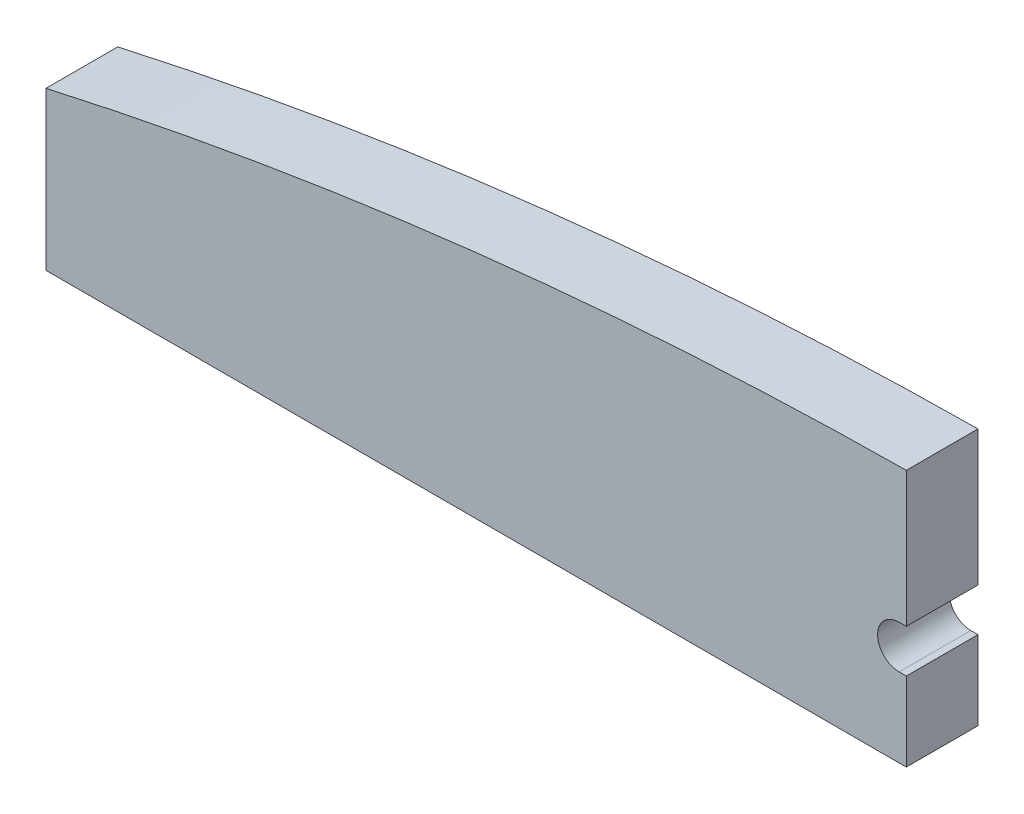
ISO-10303-21;
HEADER;
FILE_DESCRIPTION(('STEP AP214'),'2;1');
FILE_NAME('part.step','',(''),(''),'','','');
FILE_SCHEMA(('AUTOMOTIVE_DESIGN { 1 0 10303 214 1 1 1 1 }'));
ENDSEC;
DATA;
#1=APPLICATION_CONTEXT('core data for automotive mechanical design processes');
#2=APPLICATION_PROTOCOL_DEFINITION('international standard','automotive_design',2000,#1);
#3=PRODUCT_CONTEXT('',#1,'mechanical');
#4=PRODUCT('Part','Part','',(#3));
#5=PRODUCT_RELATED_PRODUCT_CATEGORY('part','',(#4));
#6=PRODUCT_DEFINITION_FORMATION('','',#4);
#7=PRODUCT_DEFINITION_CONTEXT('part definition',#1,'design');
#8=PRODUCT_DEFINITION('design','',#6,#7);
#9=PRODUCT_DEFINITION_SHAPE('','',#8);
#10=(LENGTH_UNIT() NAMED_UNIT(*) SI_UNIT(.MILLI.,.METRE.));
#11=(NAMED_UNIT(*) PLANE_ANGLE_UNIT() SI_UNIT($,.RADIAN.));
#12=(NAMED_UNIT(*) SI_UNIT($,.STERADIAN.) SOLID_ANGLE_UNIT());
#13=UNCERTAINTY_MEASURE_WITH_UNIT(LENGTH_MEASURE(1.E-05),#10,'distance_accuracy_value','');
#14=(GEOMETRIC_REPRESENTATION_CONTEXT(3) GLOBAL_UNCERTAINTY_ASSIGNED_CONTEXT((#13)) GLOBAL_UNIT_ASSIGNED_CONTEXT((#10,
#11,#12)) REPRESENTATION_CONTEXT('',''));
#15=CARTESIAN_POINT('',(0.,0.,0.));
#16=DIRECTION('',(0.,0.,1.));
#17=DIRECTION('',(1.,0.,0.));
#18=AXIS2_PLACEMENT_3D('',#15,#16,#17);
#19=CARTESIAN_POINT('',(-2.99999999999999,11.0624929759496,5.));
#20=DIRECTION('',(0.,0.,-1.));
#21=DIRECTION('',(-1.,0.,0.));
#22=AXIS2_PLACEMENT_3D('',#19,#20,#21);
#23=CYLINDRICAL_SURFACE('',#22,1.5);
#24=CARTESIAN_POINT('',(-2.99999999999999,11.0624929759496,0.));
#25=DIRECTION('',(0.,0.,1.));
#26=DIRECTION('',(1.,0.,0.));
#27=AXIS2_PLACEMENT_3D('',#24,#25,#26);
#28=CIRCLE('',#27,1.5);
#29=CARTESIAN_POINT('',(-2.99999999999999,12.5624929759496,0.));
#30=VERTEX_POINT('',#29);
#31=CARTESIAN_POINT('',(-2.99999999999999,9.56249297594958,0.));
#32=VERTEX_POINT('',#31);
#33=EDGE_CURVE('E133',#30,#32,#28,.T.);
#34=ORIENTED_EDGE('',*,*,#33,.F.);
#35=DIRECTION('',(0.,0.,-1.));
#36=VECTOR('',#35,1.);
#37=CARTESIAN_POINT('',(-2.99999999999999,12.5624929759496,5.));
#38=LINE('',#37,#36);
#39=CARTESIAN_POINT('',(-2.99999999999999,12.5624929759496,5.));
#40=VERTEX_POINT('',#39);
#41=EDGE_CURVE('E11',#40,#30,#38,.T.);
#42=ORIENTED_EDGE('',*,*,#41,.F.);
#43=CARTESIAN_POINT('',(-2.99999999999999,11.0624929759496,5.));
#44=DIRECTION('',(0.,0.,1.));
#45=DIRECTION('',(1.,0.,0.));
#46=AXIS2_PLACEMENT_3D('',#43,#44,#45);
#47=CIRCLE('',#46,1.5);
#48=CARTESIAN_POINT('',(-2.99999999999999,9.56249297594958,5.));
#49=VERTEX_POINT('',#48);
#50=EDGE_CURVE('E152',#40,#49,#47,.T.);
#51=ORIENTED_EDGE('',*,*,#50,.T.);
#52=DIRECTION('',(0.,0.,-1.));
#53=VECTOR('',#52,1.);
#54=CARTESIAN_POINT('',(-2.99999999999999,9.56249297594958,5.));
#55=LINE('',#54,#53);
#56=EDGE_CURVE('E55',#49,#32,#55,.T.);
#57=ORIENTED_EDGE('',*,*,#56,.T.);
#58=EDGE_LOOP('',(#34,#42,#51,#57));
#59=FACE_BOUND('',#58,.T.);
#60=ADVANCED_FACE('F39',(#59),#23,.F.);
#61=CARTESIAN_POINT('',(0.,12.5624929759496,5.));
#62=DIRECTION('',(0.,1.,0.));
#63=DIRECTION('',(0.,0.,1.));
#64=AXIS2_PLACEMENT_3D('',#61,#62,#63);
#65=PLANE('',#64);
#66=DIRECTION('',(1.,0.,0.));
#67=VECTOR('',#66,1.);
#68=CARTESIAN_POINT('',(0.,12.5624929759496,0.));
#69=LINE('',#68,#67);
#70=CARTESIAN_POINT('',(-2.5,12.5624929759496,0.));
#71=VERTEX_POINT('',#70);
#72=EDGE_CURVE('E135',#30,#71,#69,.T.);
#73=ORIENTED_EDGE('',*,*,#72,.T.);
#74=DIRECTION('',(0.,0.,-1.));
#75=VECTOR('',#74,1.);
#76=CARTESIAN_POINT('',(-2.5,12.5624929759496,5.));
#77=LINE('',#76,#75);
#78=CARTESIAN_POINT('',(-2.5,12.5624929759496,5.));
#79=VERTEX_POINT('',#78);
#80=EDGE_CURVE('E47',#79,#71,#77,.T.);
#81=ORIENTED_EDGE('',*,*,#80,.F.);
#82=DIRECTION('',(1.,0.,0.));
#83=VECTOR('',#82,1.);
#84=CARTESIAN_POINT('',(0.,12.5624929759496,5.));
#85=LINE('',#84,#83);
#86=EDGE_CURVE('E178',#40,#79,#85,.T.);
#87=ORIENTED_EDGE('',*,*,#86,.F.);
#88=ORIENTED_EDGE('',*,*,#41,.T.);
#89=EDGE_LOOP('',(#73,#81,#87,#88));
#90=FACE_BOUND('',#89,.T.);
#91=ADVANCED_FACE('F193',(#90),#65,.F.);
#92=CARTESIAN_POINT('',(-2.5,0.,5.));
#93=DIRECTION('',(-1.,0.,0.));
#94=DIRECTION('',(0.,0.,1.));
#95=AXIS2_PLACEMENT_3D('',#92,#93,#94);
#96=PLANE('',#95);
#97=DIRECTION('',(0.,1.,0.));
#98=VECTOR('',#97,1.);
#99=CARTESIAN_POINT('',(-2.5,0.,0.));
#100=LINE('',#99,#98);
#101=CARTESIAN_POINT('',(-2.5,21.9890348767826,0.));
#102=VERTEX_POINT('',#101);
#103=EDGE_CURVE('E137',#71,#102,#100,.T.);
#104=ORIENTED_EDGE('',*,*,#103,.T.);
#105=DIRECTION('',(0.,0.,-1.));
#106=VECTOR('',#105,1.);
#107=CARTESIAN_POINT('',(-2.5,21.9890348767826,5.));
#108=LINE('',#107,#106);
#109=CARTESIAN_POINT('',(-2.5,21.9890348767826,5.));
#110=VERTEX_POINT('',#109);
#111=EDGE_CURVE('E158',#110,#102,#108,.T.);
#112=ORIENTED_EDGE('',*,*,#111,.F.);
#113=DIRECTION('',(0.,1.,0.));
#114=VECTOR('',#113,1.);
#115=CARTESIAN_POINT('',(-2.5,0.,5.));
#116=LINE('',#115,#114);
#117=EDGE_CURVE('E166',#79,#110,#116,.T.);
#118=ORIENTED_EDGE('',*,*,#117,.F.);
#119=ORIENTED_EDGE('',*,*,#80,.T.);
#120=EDGE_LOOP('',(#104,#112,#118,#119));
#121=FACE_BOUND('',#120,.T.);
#122=ADVANCED_FACE('F164',(#121),#96,.F.);
#123=CARTESIAN_POINT('',(0.,-263.,5.));
#124=DIRECTION('',(0.,0.,-1.));
#125=DIRECTION('',(-1.,0.,0.));
#126=AXIS2_PLACEMENT_3D('',#123,#124,#125);
#127=CYLINDRICAL_SURFACE('',#126,285.);
#128=CARTESIAN_POINT('',(0.,-263.,0.));
#129=DIRECTION('',(0.,0.,1.));
#130=DIRECTION('',(1.,0.,0.));
#131=AXIS2_PLACEMENT_3D('',#128,#129,#130);
#132=CIRCLE('',#131,285.);
#133=CARTESIAN_POINT('',(-62.5,15.0624929759496,0.));
#134=VERTEX_POINT('',#133);
#135=EDGE_CURVE('E140',#134,#102,#132,.F.);
#136=ORIENTED_EDGE('',*,*,#135,.F.);
#137=DIRECTION('',(0.,0.,-1.));
#138=VECTOR('',#137,1.);
#139=CARTESIAN_POINT('',(-62.5,15.0624929759496,5.));
#140=LINE('',#139,#138);
#141=CARTESIAN_POINT('',(-62.5,15.0624929759496,5.));
#142=VERTEX_POINT('',#141);
#143=EDGE_CURVE('E156',#142,#134,#140,.T.);
#144=ORIENTED_EDGE('',*,*,#143,.F.);
#145=CARTESIAN_POINT('',(0.,-263.,5.));
#146=DIRECTION('',(0.,0.,1.));
#147=DIRECTION('',(1.,0.,0.));
#148=AXIS2_PLACEMENT_3D('',#145,#146,#147);
#149=CIRCLE('',#148,285.);
#150=EDGE_CURVE('E176',#142,#110,#149,.F.);
#151=ORIENTED_EDGE('',*,*,#150,.T.);
#152=ORIENTED_EDGE('',*,*,#111,.T.);
#153=EDGE_LOOP('',(#136,#144,#151,#152));
#154=FACE_BOUND('',#153,.T.);
#155=ADVANCED_FACE('F174',(#154),#127,.T.);
#156=CARTESIAN_POINT('',(-62.5,0.,5.));
#157=DIRECTION('',(-1.,0.,0.));
#158=DIRECTION('',(0.,0.,1.));
#159=AXIS2_PLACEMENT_3D('',#156,#157,#158);
#160=PLANE('',#159);
#161=DIRECTION('',(0.,1.,0.));
#162=VECTOR('',#161,1.);
#163=CARTESIAN_POINT('',(-62.5,0.,0.));
#164=LINE('',#163,#162);
#165=CARTESIAN_POINT('',(-62.5,4.06249297594958,0.));
#166=VERTEX_POINT('',#165);
#167=EDGE_CURVE('E143',#166,#134,#164,.T.);
#168=ORIENTED_EDGE('',*,*,#167,.F.);
#169=DIRECTION('',(0.,0.,-1.));
#170=VECTOR('',#169,1.);
#171=CARTESIAN_POINT('',(-62.5,4.06249297594958,5.));
#172=LINE('',#171,#170);
#173=CARTESIAN_POINT('',(-62.5,4.06249297594958,5.));
#174=VERTEX_POINT('',#173);
#175=EDGE_CURVE('E125',#174,#166,#172,.T.);
#176=ORIENTED_EDGE('',*,*,#175,.F.);
#177=DIRECTION('',(0.,1.,0.));
#178=VECTOR('',#177,1.);
#179=CARTESIAN_POINT('',(-62.5,0.,5.));
#180=LINE('',#179,#178);
#181=EDGE_CURVE('E115',#174,#142,#180,.T.);
#182=ORIENTED_EDGE('',*,*,#181,.T.);
#183=ORIENTED_EDGE('',*,*,#143,.T.);
#184=EDGE_LOOP('',(#168,#176,#182,#183));
#185=FACE_BOUND('',#184,.T.);
#186=ADVANCED_FACE('F204',(#185),#160,.T.);
#187=CARTESIAN_POINT('',(0.,4.06249297594958,5.));
#188=DIRECTION('',(0.,1.,0.));
#189=DIRECTION('',(0.,0.,1.));
#190=AXIS2_PLACEMENT_3D('',#187,#188,#189);
#191=PLANE('',#190);
#192=DIRECTION('',(1.,0.,0.));
#193=VECTOR('',#192,1.);
#194=CARTESIAN_POINT('',(0.,4.06249297594958,0.));
#195=LINE('',#194,#193);
#196=CARTESIAN_POINT('',(-2.5,4.06249297594958,0.));
#197=VERTEX_POINT('',#196);
#198=EDGE_CURVE('E122',#166,#197,#195,.T.);
#199=ORIENTED_EDGE('',*,*,#198,.T.);
#200=DIRECTION('',(0.,0.,-1.));
#201=VECTOR('',#200,1.);
#202=CARTESIAN_POINT('',(-2.5,4.06249297594958,5.));
#203=LINE('',#202,#201);
#204=CARTESIAN_POINT('',(-2.5,4.06249297594958,5.));
#205=VERTEX_POINT('',#204);
#206=EDGE_CURVE('E119',#205,#197,#203,.T.);
#207=ORIENTED_EDGE('',*,*,#206,.F.);
#208=DIRECTION('',(1.,0.,0.));
#209=VECTOR('',#208,1.);
#210=CARTESIAN_POINT('',(0.,4.06249297594958,5.));
#211=LINE('',#210,#209);
#212=EDGE_CURVE('E106',#174,#205,#211,.T.);
#213=ORIENTED_EDGE('',*,*,#212,.F.);
#214=ORIENTED_EDGE('',*,*,#175,.T.);
#215=EDGE_LOOP('',(#199,#207,#213,#214));
#216=FACE_BOUND('',#215,.T.);
#217=ADVANCED_FACE('F120',(#216),#191,.F.);
#218=CARTESIAN_POINT('',(-2.5,0.,5.));
#219=DIRECTION('',(-1.,0.,0.));
#220=DIRECTION('',(0.,0.,1.));
#221=AXIS2_PLACEMENT_3D('',#218,#219,#220);
#222=PLANE('',#221);
#223=DIRECTION('',(0.,1.,0.));
#224=VECTOR('',#223,1.);
#225=CARTESIAN_POINT('',(-2.5,0.,0.));
#226=LINE('',#225,#224);
#227=CARTESIAN_POINT('',(-2.5,9.56249297594958,0.));
#228=VERTEX_POINT('',#227);
#229=EDGE_CURVE('E147',#197,#228,#226,.T.);
#230=ORIENTED_EDGE('',*,*,#229,.T.);
#231=DIRECTION('',(0.,0.,-1.));
#232=VECTOR('',#231,1.);
#233=CARTESIAN_POINT('',(-2.5,9.56249297594958,5.));
#234=LINE('',#233,#232);
#235=CARTESIAN_POINT('',(-2.5,9.56249297594958,5.));
#236=VERTEX_POINT('',#235);
#237=EDGE_CURVE('E81',#236,#228,#234,.T.);
#238=ORIENTED_EDGE('',*,*,#237,.F.);
#239=DIRECTION('',(0.,1.,0.));
#240=VECTOR('',#239,1.);
#241=CARTESIAN_POINT('',(-2.5,0.,5.));
#242=LINE('',#241,#240);
#243=EDGE_CURVE('E112',#205,#236,#242,.T.);
#244=ORIENTED_EDGE('',*,*,#243,.F.);
#245=ORIENTED_EDGE('',*,*,#206,.T.);
#246=EDGE_LOOP('',(#230,#238,#244,#245));
#247=FACE_BOUND('',#246,.T.);
#248=ADVANCED_FACE('F127',(#247),#222,.F.);
#249=CARTESIAN_POINT('',(0.,9.56249297594958,5.));
#250=DIRECTION('',(0.,1.,0.));
#251=DIRECTION('',(0.,0.,1.));
#252=AXIS2_PLACEMENT_3D('',#249,#250,#251);
#253=PLANE('',#252);
#254=DIRECTION('',(1.,0.,0.));
#255=VECTOR('',#254,1.);
#256=CARTESIAN_POINT('',(0.,9.56249297594958,0.));
#257=LINE('',#256,#255);
#258=EDGE_CURVE('E149',#32,#228,#257,.T.);
#259=ORIENTED_EDGE('',*,*,#258,.F.);
#260=ORIENTED_EDGE('',*,*,#56,.F.);
#261=DIRECTION('',(1.,0.,0.));
#262=VECTOR('',#261,1.);
#263=CARTESIAN_POINT('',(0.,9.56249297594958,5.));
#264=LINE('',#263,#262);
#265=EDGE_CURVE('E128',#49,#236,#264,.T.);
#266=ORIENTED_EDGE('',*,*,#265,.T.);
#267=ORIENTED_EDGE('',*,*,#237,.T.);
#268=EDGE_LOOP('',(#259,#260,#266,#267));
#269=FACE_BOUND('',#268,.T.);
#270=ADVANCED_FACE('F182',(#269),#253,.T.);
#271=CARTESIAN_POINT('',(0.,0.,5.));
#272=DIRECTION('',(0.,0.,1.));
#273=DIRECTION('',(1.,0.,0.));
#274=AXIS2_PLACEMENT_3D('',#271,#272,#273);
#275=PLANE('',#274);
#276=ORIENTED_EDGE('',*,*,#50,.F.);
#277=ORIENTED_EDGE('',*,*,#86,.T.);
#278=ORIENTED_EDGE('',*,*,#117,.T.);
#279=ORIENTED_EDGE('',*,*,#150,.F.);
#280=ORIENTED_EDGE('',*,*,#181,.F.);
#281=ORIENTED_EDGE('',*,*,#212,.T.);
#282=ORIENTED_EDGE('',*,*,#243,.T.);
#283=ORIENTED_EDGE('',*,*,#265,.F.);
#284=EDGE_LOOP('',(#276,#277,#278,#279,#280,#281,#282,#283));
#285=FACE_BOUND('',#284,.T.);
#286=ADVANCED_FACE('F109',(#285),#275,.T.);
#287=CARTESIAN_POINT('',(0.,0.,0.));
#288=DIRECTION('',(0.,0.,1.));
#289=DIRECTION('',(1.,0.,0.));
#290=AXIS2_PLACEMENT_3D('',#287,#288,#289);
#291=PLANE('',#290);
#292=ORIENTED_EDGE('',*,*,#33,.T.);
#293=ORIENTED_EDGE('',*,*,#258,.T.);
#294=ORIENTED_EDGE('',*,*,#229,.F.);
#295=ORIENTED_EDGE('',*,*,#198,.F.);
#296=ORIENTED_EDGE('',*,*,#167,.T.);
#297=ORIENTED_EDGE('',*,*,#135,.T.);
#298=ORIENTED_EDGE('',*,*,#103,.F.);
#299=ORIENTED_EDGE('',*,*,#72,.F.);
#300=EDGE_LOOP('',(#292,#293,#294,#295,#296,#297,#298,#299));
#301=FACE_BOUND('',#300,.T.);
#302=ADVANCED_FACE('F170',(#301),#291,.F.);
#303=CLOSED_SHELL('',(#60,#91,#122,#155,#186,#217,#248,#270,#286,#302));
#304=MANIFOLD_SOLID_BREP('B2',#303);
#305=ADVANCED_BREP_SHAPE_REPRESENTATION('',(#18,#304),#14);
#306=SHAPE_DEFINITION_REPRESENTATION(#9,#305);
ENDSEC;
END-ISO-10303-21;
